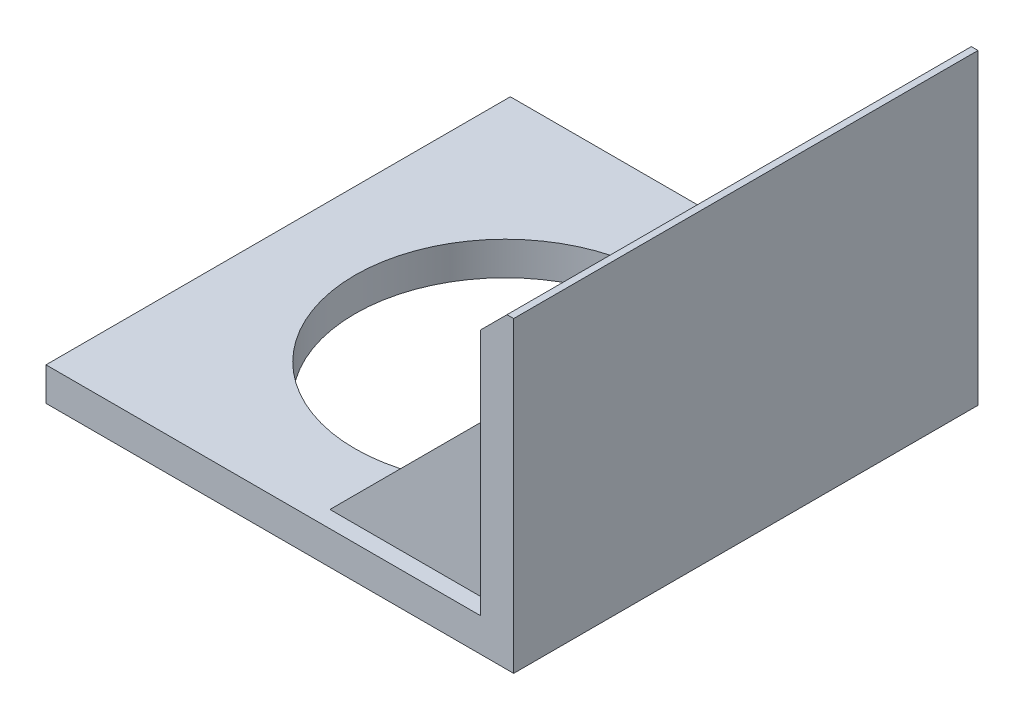
ISO-10303-21;
HEADER;
FILE_DESCRIPTION(('STEP AP214'),'2;1');
FILE_NAME('part.step','',(''),(''),'','','');
FILE_SCHEMA(('AUTOMOTIVE_DESIGN { 1 0 10303 214 1 1 1 1 }'));
ENDSEC;
DATA;
#1=APPLICATION_CONTEXT('core data for automotive mechanical design processes');
#2=APPLICATION_PROTOCOL_DEFINITION('international standard','automotive_design',2000,#1);
#3=PRODUCT_CONTEXT('',#1,'mechanical');
#4=PRODUCT('Part','Part','',(#3));
#5=PRODUCT_RELATED_PRODUCT_CATEGORY('part','',(#4));
#6=PRODUCT_DEFINITION_FORMATION('','',#4);
#7=PRODUCT_DEFINITION_CONTEXT('part definition',#1,'design');
#8=PRODUCT_DEFINITION('design','',#6,#7);
#9=PRODUCT_DEFINITION_SHAPE('','',#8);
#10=(LENGTH_UNIT() NAMED_UNIT(*) SI_UNIT(.MILLI.,.METRE.));
#11=(NAMED_UNIT(*) PLANE_ANGLE_UNIT() SI_UNIT($,.RADIAN.));
#12=(NAMED_UNIT(*) SI_UNIT($,.STERADIAN.) SOLID_ANGLE_UNIT());
#13=UNCERTAINTY_MEASURE_WITH_UNIT(LENGTH_MEASURE(1.E-05),#10,'distance_accuracy_value','');
#14=(GEOMETRIC_REPRESENTATION_CONTEXT(3) GLOBAL_UNCERTAINTY_ASSIGNED_CONTEXT((#13)) GLOBAL_UNIT_ASSIGNED_CONTEXT((#10,
#11,#12)) REPRESENTATION_CONTEXT('',''));
#15=CARTESIAN_POINT('',(0.,0.,0.));
#16=DIRECTION('',(0.,0.,1.));
#17=DIRECTION('',(1.,0.,0.));
#18=AXIS2_PLACEMENT_3D('',#15,#16,#17);
#19=CARTESIAN_POINT('',(0.,10.,0.));
#20=DIRECTION('',(0.,-1.,0.));
#21=DIRECTION('',(0.,0.,-1.));
#22=AXIS2_PLACEMENT_3D('',#19,#20,#21);
#23=PLANE('',#22);
#24=CARTESIAN_POINT('',(0.,10.,0.));
#25=DIRECTION('',(0.,1.,0.));
#26=DIRECTION('',(0.,0.,1.));
#27=AXIS2_PLACEMENT_3D('',#24,#25,#26);
#28=CIRCLE('',#27,45.);
#29=CARTESIAN_POINT('',(0.,10.,45.));
#30=VERTEX_POINT('',#29);
#31=EDGE_CURVE('E200',#30,#30,#28,.T.);
#32=ORIENTED_EDGE('',*,*,#31,.F.);
#33=EDGE_LOOP('',(#32));
#34=FACE_BOUND('',#33,.T.);
#35=DIRECTION('',(1.,0.,0.));
#36=VECTOR('',#35,1.);
#37=CARTESIAN_POINT('',(12.0000000000035,10.,-64.4999999999999));
#38=LINE('',#37,#36);
#39=CARTESIAN_POINT('',(12.0000000000035,10.,-64.4999999999999));
#40=VERTEX_POINT('',#39);
#41=CARTESIAN_POINT('',(62.0000000000035,10.,-64.4999999999999));
#42=VERTEX_POINT('',#41);
#43=EDGE_CURVE('E139',#40,#42,#38,.T.);
#44=ORIENTED_EDGE('',*,*,#43,.T.);
#45=DIRECTION('',(0.,0.,1.));
#46=VECTOR('',#45,1.);
#47=CARTESIAN_POINT('',(62.0000000000035,10.,-69.5000000000001));
#48=LINE('',#47,#46);
#49=CARTESIAN_POINT('',(62.0000000000035,10.,-69.5000000000001));
#50=VERTEX_POINT('',#49);
#51=EDGE_CURVE('E187',#50,#42,#48,.T.);
#52=ORIENTED_EDGE('',*,*,#51,.F.);
#53=DIRECTION('',(-1.,0.,0.));
#54=VECTOR('',#53,1.);
#55=CARTESIAN_POINT('',(3.49148133884313E-12,10.,-69.5000000000001));
#56=LINE('',#55,#54);
#57=CARTESIAN_POINT('',(-67.9999999999965,10.,-69.5));
#58=VERTEX_POINT('',#57);
#59=EDGE_CURVE('E206',#50,#58,#56,.T.);
#60=ORIENTED_EDGE('',*,*,#59,.T.);
#61=DIRECTION('',(0.,0.,1.));
#62=VECTOR('',#61,1.);
#63=CARTESIAN_POINT('',(-67.9999999999965,10.,-69.5));
#64=LINE('',#63,#62);
#65=CARTESIAN_POINT('',(-67.9999999999965,10.,69.5));
#66=VERTEX_POINT('',#65);
#67=EDGE_CURVE('E208',#58,#66,#64,.T.);
#68=ORIENTED_EDGE('',*,*,#67,.T.);
#69=DIRECTION('',(1.,0.,0.));
#70=VECTOR('',#69,1.);
#71=CARTESIAN_POINT('',(3.49148133884313E-12,10.,69.5000000000001));
#72=LINE('',#71,#70);
#73=CARTESIAN_POINT('',(62.0000000000035,10.,69.5000000000001));
#74=VERTEX_POINT('',#73);
#75=EDGE_CURVE('E211',#66,#74,#72,.T.);
#76=ORIENTED_EDGE('',*,*,#75,.T.);
#77=CARTESIAN_POINT('',(62.0000000000035,10.,64.5000000000001));
#78=VERTEX_POINT('',#77);
#79=EDGE_CURVE('E181',#78,#74,#48,.T.);
#80=ORIENTED_EDGE('',*,*,#79,.F.);
#81=DIRECTION('',(1.,0.,0.));
#82=VECTOR('',#81,1.);
#83=CARTESIAN_POINT('',(12.0000000000035,10.,64.5000000000001));
#84=LINE('',#83,#82);
#85=CARTESIAN_POINT('',(12.0000000000035,10.,64.5000000000001));
#86=VERTEX_POINT('',#85);
#87=EDGE_CURVE('E64',#86,#78,#84,.T.);
#88=ORIENTED_EDGE('',*,*,#87,.F.);
#89=DIRECTION('',(0.,0.,1.));
#90=VECTOR('',#89,1.);
#91=CARTESIAN_POINT('',(12.0000000000035,10.,56.5000000000001));
#92=LINE('',#91,#90);
#93=CARTESIAN_POINT('',(12.0000000000035,10.,56.5000000000001));
#94=VERTEX_POINT('',#93);
#95=EDGE_CURVE('E174',#94,#86,#92,.T.);
#96=ORIENTED_EDGE('',*,*,#95,.F.);
#97=DIRECTION('',(1.,0.,0.));
#98=VECTOR('',#97,1.);
#99=CARTESIAN_POINT('',(12.0000000000035,10.,56.5000000000001));
#100=LINE('',#99,#98);
#101=CARTESIAN_POINT('',(62.0000000000035,10.,56.5000000000001));
#102=VERTEX_POINT('',#101);
#103=EDGE_CURVE('E167',#94,#102,#100,.T.);
#104=ORIENTED_EDGE('',*,*,#103,.T.);
#105=CARTESIAN_POINT('',(62.0000000000035,10.,-56.4999999999999));
#106=VERTEX_POINT('',#105);
#107=EDGE_CURVE('E194',#106,#102,#48,.T.);
#108=ORIENTED_EDGE('',*,*,#107,.F.);
#109=DIRECTION('',(1.,0.,0.));
#110=VECTOR('',#109,1.);
#111=CARTESIAN_POINT('',(12.0000000000035,10.,-56.4999999999999));
#112=LINE('',#111,#110);
#113=CARTESIAN_POINT('',(12.0000000000035,10.,-56.4999999999999));
#114=VERTEX_POINT('',#113);
#115=EDGE_CURVE('E56',#114,#106,#112,.T.);
#116=ORIENTED_EDGE('',*,*,#115,.F.);
#117=DIRECTION('',(0.,0.,1.));
#118=VECTOR('',#117,1.);
#119=CARTESIAN_POINT('',(12.0000000000035,10.,-64.4999999999999));
#120=LINE('',#119,#118);
#121=EDGE_CURVE('E152',#40,#114,#120,.T.);
#122=ORIENTED_EDGE('',*,*,#121,.F.);
#123=EDGE_LOOP('',(#44,#52,#60,#68,#76,#80,#88,#96,#104,#108,#116,#122));
#124=FACE_BOUND('',#123,.T.);
#125=ADVANCED_FACE('F41',(#34,#124),#23,.F.);
#126=CARTESIAN_POINT('',(62.0000000000035,92.,-69.5000000000001));
#127=DIRECTION('',(1.,0.,0.));
#128=DIRECTION('',(0.,0.,-1.));
#129=AXIS2_PLACEMENT_3D('',#126,#127,#128);
#130=PLANE('',#129);
#131=DIRECTION('',(0.,1.,0.));
#132=VECTOR('',#131,1.);
#133=CARTESIAN_POINT('',(62.0000000000035,10.,-64.4999999999999));
#134=LINE('',#133,#132);
#135=CARTESIAN_POINT('',(62.0000000000035,60.,-64.4999999999999));
#136=VERTEX_POINT('',#135);
#137=EDGE_CURVE('E144',#42,#136,#134,.T.);
#138=ORIENTED_EDGE('',*,*,#137,.T.);
#139=DIRECTION('',(0.,0.,1.));
#140=VECTOR('',#139,1.);
#141=CARTESIAN_POINT('',(62.0000000000035,60.,-64.4999999999999));
#142=LINE('',#141,#140);
#143=CARTESIAN_POINT('',(62.0000000000035,60.,-56.4999999999999));
#144=VERTEX_POINT('',#143);
#145=EDGE_CURVE('E154',#136,#144,#142,.T.);
#146=ORIENTED_EDGE('',*,*,#145,.T.);
#147=DIRECTION('',(0.,1.,0.));
#148=VECTOR('',#147,1.);
#149=CARTESIAN_POINT('',(62.0000000000035,10.,-56.4999999999999));
#150=LINE('',#149,#148);
#151=EDGE_CURVE('E155',#106,#144,#150,.T.);
#152=ORIENTED_EDGE('',*,*,#151,.F.);
#153=ORIENTED_EDGE('',*,*,#107,.T.);
#154=DIRECTION('',(0.,1.,0.));
#155=VECTOR('',#154,1.);
#156=CARTESIAN_POINT('',(62.0000000000035,10.,56.5000000000001));
#157=LINE('',#156,#155);
#158=CARTESIAN_POINT('',(62.0000000000035,60.,56.5000000000001));
#159=VERTEX_POINT('',#158);
#160=EDGE_CURVE('E171',#102,#159,#157,.T.);
#161=ORIENTED_EDGE('',*,*,#160,.T.);
#162=DIRECTION('',(0.,0.,1.));
#163=VECTOR('',#162,1.);
#164=CARTESIAN_POINT('',(62.0000000000035,60.,56.5000000000001));
#165=LINE('',#164,#163);
#166=CARTESIAN_POINT('',(62.0000000000035,60.,64.5000000000001));
#167=VERTEX_POINT('',#166);
#168=EDGE_CURVE('E178',#159,#167,#165,.T.);
#169=ORIENTED_EDGE('',*,*,#168,.T.);
#170=DIRECTION('',(0.,1.,0.));
#171=VECTOR('',#170,1.);
#172=CARTESIAN_POINT('',(62.0000000000035,10.,64.5000000000001));
#173=LINE('',#172,#171);
#174=EDGE_CURVE('E168',#78,#167,#173,.T.);
#175=ORIENTED_EDGE('',*,*,#174,.F.);
#176=ORIENTED_EDGE('',*,*,#79,.T.);
#177=DIRECTION('',(0.,-1.,0.));
#178=VECTOR('',#177,1.);
#179=CARTESIAN_POINT('',(62.0000000000035,92.,69.5000000000001));
#180=LINE('',#179,#178);
#181=CARTESIAN_POINT('',(62.0000000000035,84.,69.5000000000001));
#182=VERTEX_POINT('',#181);
#183=EDGE_CURVE('E192',#182,#74,#180,.T.);
#184=ORIENTED_EDGE('',*,*,#183,.F.);
#185=DIRECTION('',(0.,0.,-1.));
#186=VECTOR('',#185,1.);
#187=CARTESIAN_POINT('',(62.0000000000035,84.,-69.5000000000001));
#188=LINE('',#187,#186);
#189=CARTESIAN_POINT('',(62.0000000000035,84.,-69.5000000000001));
#190=VERTEX_POINT('',#189);
#191=EDGE_CURVE('E49',#182,#190,#188,.T.);
#192=ORIENTED_EDGE('',*,*,#191,.T.);
#193=DIRECTION('',(0.,-1.,0.));
#194=VECTOR('',#193,1.);
#195=CARTESIAN_POINT('',(62.0000000000035,92.,-69.5000000000001));
#196=LINE('',#195,#194);
#197=EDGE_CURVE('E197',#190,#50,#196,.T.);
#198=ORIENTED_EDGE('',*,*,#197,.T.);
#199=ORIENTED_EDGE('',*,*,#51,.T.);
#200=EDGE_LOOP('',(#138,#146,#152,#153,#161,#169,#175,#176,#184,#192,#198,#199));
#201=FACE_BOUND('',#200,.T.);
#202=ADVANCED_FACE('F242',(#201),#130,.F.);
#203=CARTESIAN_POINT('',(0.,0.,0.));
#204=DIRECTION('',(0.,-1.,0.));
#205=DIRECTION('',(0.,0.,-1.));
#206=AXIS2_PLACEMENT_3D('',#203,#204,#205);
#207=PLANE('',#206);
#208=DIRECTION('',(-1.,0.,0.));
#209=VECTOR('',#208,1.);
#210=CARTESIAN_POINT('',(3.49148133884313E-12,0.,-69.5000000000001));
#211=LINE('',#210,#209);
#212=CARTESIAN_POINT('',(72.0000000000035,0.,-69.5000000000001));
#213=VERTEX_POINT('',#212);
#214=CARTESIAN_POINT('',(-67.9999999999965,0.,-69.5));
#215=VERTEX_POINT('',#214);
#216=EDGE_CURVE('E203',#213,#215,#211,.T.);
#217=ORIENTED_EDGE('',*,*,#216,.F.);
#218=DIRECTION('',(0.,0.,-1.));
#219=VECTOR('',#218,1.);
#220=CARTESIAN_POINT('',(72.0000000000035,0.,-69.5000000000001));
#221=LINE('',#220,#219);
#222=CARTESIAN_POINT('',(72.0000000000035,0.,69.5000000000001));
#223=VERTEX_POINT('',#222);
#224=EDGE_CURVE('E209',#223,#213,#221,.T.);
#225=ORIENTED_EDGE('',*,*,#224,.F.);
#226=DIRECTION('',(1.,0.,0.));
#227=VECTOR('',#226,1.);
#228=CARTESIAN_POINT('',(3.49148133884313E-12,0.,69.5000000000001));
#229=LINE('',#228,#227);
#230=CARTESIAN_POINT('',(-67.9999999999965,0.,69.5));
#231=VERTEX_POINT('',#230);
#232=EDGE_CURVE('E219',#231,#223,#229,.T.);
#233=ORIENTED_EDGE('',*,*,#232,.F.);
#234=DIRECTION('',(0.,0.,1.));
#235=VECTOR('',#234,1.);
#236=CARTESIAN_POINT('',(-67.9999999999965,0.,-69.5));
#237=LINE('',#236,#235);
#238=EDGE_CURVE('E216',#215,#231,#237,.T.);
#239=ORIENTED_EDGE('',*,*,#238,.F.);
#240=EDGE_LOOP('',(#217,#225,#233,#239));
#241=FACE_BOUND('',#240,.T.);
#242=CARTESIAN_POINT('',(0.,0.,0.));
#243=DIRECTION('',(0.,1.,0.));
#244=DIRECTION('',(0.,0.,1.));
#245=AXIS2_PLACEMENT_3D('',#242,#243,#244);
#246=CIRCLE('',#245,45.);
#247=CARTESIAN_POINT('',(0.,0.,45.));
#248=VERTEX_POINT('',#247);
#249=EDGE_CURVE('E199',#248,#248,#246,.T.);
#250=ORIENTED_EDGE('',*,*,#249,.T.);
#251=EDGE_LOOP('',(#250));
#252=FACE_BOUND('',#251,.T.);
#253=ADVANCED_FACE('F267',(#241,#252),#207,.T.);
#254=CARTESIAN_POINT('',(3.49148133884313E-12,10.,-69.5000000000001));
#255=DIRECTION('',(0.,0.,1.));
#256=DIRECTION('',(1.,0.,0.));
#257=AXIS2_PLACEMENT_3D('',#254,#255,#256);
#258=PLANE('',#257);
#259=ORIENTED_EDGE('',*,*,#197,.F.);
#260=DIRECTION('',(-0.707106781186547,-0.707106781186548,0.));
#261=VECTOR('',#260,1.);
#262=CARTESIAN_POINT('',(70.0000000000034,91.9999999999999,-69.5000000000002));
#263=LINE('',#262,#261);
#264=CARTESIAN_POINT('',(70.0000000000035,92.,-69.5000000000001));
#265=VERTEX_POINT('',#264);
#266=EDGE_CURVE('E11',#190,#265,#263,.F.);
#267=ORIENTED_EDGE('',*,*,#266,.T.);
#268=DIRECTION('',(-1.,0.,0.));
#269=VECTOR('',#268,1.);
#270=CARTESIAN_POINT('',(72.0000000000035,92.,-69.5000000000001));
#271=LINE('',#270,#269);
#272=CARTESIAN_POINT('',(72.0000000000035,92.,-69.5000000000001));
#273=VERTEX_POINT('',#272);
#274=EDGE_CURVE('E186',#273,#265,#271,.T.);
#275=ORIENTED_EDGE('',*,*,#274,.F.);
#276=DIRECTION('',(0.,-1.,0.));
#277=VECTOR('',#276,1.);
#278=CARTESIAN_POINT('',(72.0000000000035,10.,-69.5000000000001));
#279=LINE('',#278,#277);
#280=EDGE_CURVE('E214',#273,#213,#279,.T.);
#281=ORIENTED_EDGE('',*,*,#280,.T.);
#282=ORIENTED_EDGE('',*,*,#216,.T.);
#283=DIRECTION('',(0.,-1.,0.));
#284=VECTOR('',#283,1.);
#285=CARTESIAN_POINT('',(-67.9999999999965,10.,-69.5));
#286=LINE('',#285,#284);
#287=EDGE_CURVE('E231',#58,#215,#286,.T.);
#288=ORIENTED_EDGE('',*,*,#287,.F.);
#289=ORIENTED_EDGE('',*,*,#59,.F.);
#290=EDGE_LOOP('',(#259,#267,#275,#281,#282,#288,#289));
#291=FACE_BOUND('',#290,.T.);
#292=ADVANCED_FACE('F247',(#291),#258,.F.);
#293=CARTESIAN_POINT('',(-67.9999999999965,10.,-69.5));
#294=DIRECTION('',(1.,0.,0.));
#295=DIRECTION('',(0.,0.,-1.));
#296=AXIS2_PLACEMENT_3D('',#293,#294,#295);
#297=PLANE('',#296);
#298=ORIENTED_EDGE('',*,*,#238,.T.);
#299=DIRECTION('',(0.,-1.,0.));
#300=VECTOR('',#299,1.);
#301=CARTESIAN_POINT('',(-67.9999999999965,10.,69.5));
#302=LINE('',#301,#300);
#303=EDGE_CURVE('E228',#66,#231,#302,.T.);
#304=ORIENTED_EDGE('',*,*,#303,.F.);
#305=ORIENTED_EDGE('',*,*,#67,.F.);
#306=ORIENTED_EDGE('',*,*,#287,.T.);
#307=EDGE_LOOP('',(#298,#304,#305,#306));
#308=FACE_BOUND('',#307,.T.);
#309=ADVANCED_FACE('F265',(#308),#297,.F.);
#310=CARTESIAN_POINT('',(3.49148133884313E-12,10.,69.5000000000001));
#311=DIRECTION('',(0.,0.,-1.));
#312=DIRECTION('',(-1.,0.,0.));
#313=AXIS2_PLACEMENT_3D('',#310,#311,#312);
#314=PLANE('',#313);
#315=DIRECTION('',(1.,0.,0.));
#316=VECTOR('',#315,1.);
#317=CARTESIAN_POINT('',(72.0000000000035,92.,69.5000000000001));
#318=LINE('',#317,#316);
#319=CARTESIAN_POINT('',(70.0000000000035,92.,69.5000000000001));
#320=VERTEX_POINT('',#319);
#321=CARTESIAN_POINT('',(72.0000000000035,92.,69.5000000000001));
#322=VERTEX_POINT('',#321);
#323=EDGE_CURVE('E190',#320,#322,#318,.T.);
#324=ORIENTED_EDGE('',*,*,#323,.F.);
#325=DIRECTION('',(0.707106781186547,0.707106781186548,0.));
#326=VECTOR('',#325,1.);
#327=CARTESIAN_POINT('',(70.0000000000035,92.,69.5000000000001));
#328=LINE('',#327,#326);
#329=EDGE_CURVE('E237',#320,#182,#328,.F.);
#330=ORIENTED_EDGE('',*,*,#329,.T.);
#331=ORIENTED_EDGE('',*,*,#183,.T.);
#332=ORIENTED_EDGE('',*,*,#75,.F.);
#333=ORIENTED_EDGE('',*,*,#303,.T.);
#334=ORIENTED_EDGE('',*,*,#232,.T.);
#335=DIRECTION('',(0.,-1.,0.));
#336=VECTOR('',#335,1.);
#337=CARTESIAN_POINT('',(72.0000000000035,10.,69.5000000000001));
#338=LINE('',#337,#336);
#339=EDGE_CURVE('E225',#322,#223,#338,.T.);
#340=ORIENTED_EDGE('',*,*,#339,.F.);
#341=EDGE_LOOP('',(#324,#330,#331,#332,#333,#334,#340));
#342=FACE_BOUND('',#341,.T.);
#343=ADVANCED_FACE('F256',(#342),#314,.F.);
#344=CARTESIAN_POINT('',(72.0000000000035,10.,-69.5000000000001));
#345=DIRECTION('',(-1.,0.,0.));
#346=DIRECTION('',(0.,0.,1.));
#347=AXIS2_PLACEMENT_3D('',#344,#345,#346);
#348=PLANE('',#347);
#349=ORIENTED_EDGE('',*,*,#224,.T.);
#350=ORIENTED_EDGE('',*,*,#280,.F.);
#351=DIRECTION('',(0.,0.,-1.));
#352=VECTOR('',#351,1.);
#353=CARTESIAN_POINT('',(72.0000000000035,92.,-69.5000000000001));
#354=LINE('',#353,#352);
#355=EDGE_CURVE('E183',#322,#273,#354,.T.);
#356=ORIENTED_EDGE('',*,*,#355,.F.);
#357=ORIENTED_EDGE('',*,*,#339,.T.);
#358=EDGE_LOOP('',(#349,#350,#356,#357));
#359=FACE_BOUND('',#358,.T.);
#360=ADVANCED_FACE('F260',(#359),#348,.F.);
#361=CARTESIAN_POINT('',(0.,10.,0.));
#362=DIRECTION('',(0.,-1.,0.));
#363=DIRECTION('',(0.,0.,-1.));
#364=AXIS2_PLACEMENT_3D('',#361,#362,#363);
#365=CYLINDRICAL_SURFACE('',#364,45.);
#366=ORIENTED_EDGE('',*,*,#31,.T.);
#367=EDGE_LOOP('',(#366));
#368=FACE_BOUND('',#367,.T.);
#369=ORIENTED_EDGE('',*,*,#249,.F.);
#370=EDGE_LOOP('',(#369));
#371=FACE_BOUND('',#370,.T.);
#372=ADVANCED_FACE('F273',(#368,#371),#365,.F.);
#373=CARTESIAN_POINT('',(0.,92.,0.));
#374=DIRECTION('',(0.,-1.,0.));
#375=DIRECTION('',(0.,0.,-1.));
#376=AXIS2_PLACEMENT_3D('',#373,#374,#375);
#377=PLANE('',#376);
#378=ORIENTED_EDGE('',*,*,#274,.T.);
#379=DIRECTION('',(0.,0.,1.));
#380=VECTOR('',#379,1.);
#381=CARTESIAN_POINT('',(70.0000000000035,92.,0.));
#382=LINE('',#381,#380);
#383=EDGE_CURVE('E234',#265,#320,#382,.T.);
#384=ORIENTED_EDGE('',*,*,#383,.T.);
#385=ORIENTED_EDGE('',*,*,#323,.T.);
#386=ORIENTED_EDGE('',*,*,#355,.T.);
#387=EDGE_LOOP('',(#378,#384,#385,#386));
#388=FACE_BOUND('',#387,.T.);
#389=ADVANCED_FACE('F253',(#388),#377,.F.);
#390=CARTESIAN_POINT('',(70.0000000000035,92.,0.));
#391=DIRECTION('',(0.707106781186548,-0.707106781186547,0.));
#392=DIRECTION('',(0.,0.,1.));
#393=AXIS2_PLACEMENT_3D('',#390,#391,#392);
#394=PLANE('',#393);
#395=ORIENTED_EDGE('',*,*,#266,.F.);
#396=ORIENTED_EDGE('',*,*,#191,.F.);
#397=ORIENTED_EDGE('',*,*,#329,.F.);
#398=ORIENTED_EDGE('',*,*,#383,.F.);
#399=EDGE_LOOP('',(#395,#396,#397,#398));
#400=FACE_BOUND('',#399,.T.);
#401=ADVANCED_FACE('F43',(#400),#394,.F.);
#402=CARTESIAN_POINT('',(62.0000000000035,60.,56.5000000000001));
#403=DIRECTION('',(-0.707106781186548,0.707106781186547,0.));
#404=DIRECTION('',(-0.707106781186547,-0.707106781186548,0.));
#405=AXIS2_PLACEMENT_3D('',#402,#403,#404);
#406=PLANE('',#405);
#407=DIRECTION('',(-0.707106781186547,-0.707106781186548,0.));
#408=VECTOR('',#407,1.);
#409=CARTESIAN_POINT('',(62.0000000000035,60.,64.5000000000001));
#410=LINE('',#409,#408);
#411=EDGE_CURVE('E159',#167,#86,#410,.T.);
#412=ORIENTED_EDGE('',*,*,#411,.F.);
#413=ORIENTED_EDGE('',*,*,#168,.F.);
#414=DIRECTION('',(-0.707106781186547,-0.707106781186548,0.));
#415=VECTOR('',#414,1.);
#416=CARTESIAN_POINT('',(62.0000000000035,60.,56.5000000000001));
#417=LINE('',#416,#415);
#418=EDGE_CURVE('E164',#159,#94,#417,.T.);
#419=ORIENTED_EDGE('',*,*,#418,.T.);
#420=ORIENTED_EDGE('',*,*,#95,.T.);
#421=EDGE_LOOP('',(#412,#413,#419,#420));
#422=FACE_BOUND('',#421,.T.);
#423=ADVANCED_FACE('F318',(#422),#406,.T.);
#424=CARTESIAN_POINT('',(0.,0.,56.5000000000001));
#425=DIRECTION('',(0.,0.,1.));
#426=DIRECTION('',(1.,0.,0.));
#427=AXIS2_PLACEMENT_3D('',#424,#425,#426);
#428=PLANE('',#427);
#429=ORIENTED_EDGE('',*,*,#418,.F.);
#430=ORIENTED_EDGE('',*,*,#160,.F.);
#431=ORIENTED_EDGE('',*,*,#103,.F.);
#432=EDGE_LOOP('',(#429,#430,#431));
#433=FACE_BOUND('',#432,.T.);
#434=ADVANCED_FACE('F325',(#433),#428,.F.);
#435=CARTESIAN_POINT('',(0.,0.,64.5000000000001));
#436=DIRECTION('',(0.,0.,1.));
#437=DIRECTION('',(1.,0.,0.));
#438=AXIS2_PLACEMENT_3D('',#435,#436,#437);
#439=PLANE('',#438);
#440=ORIENTED_EDGE('',*,*,#411,.T.);
#441=ORIENTED_EDGE('',*,*,#87,.T.);
#442=ORIENTED_EDGE('',*,*,#174,.T.);
#443=EDGE_LOOP('',(#440,#441,#442));
#444=FACE_BOUND('',#443,.T.);
#445=ADVANCED_FACE('F333',(#444),#439,.T.);
#446=CARTESIAN_POINT('',(62.0000000000035,60.,-64.4999999999999));
#447=DIRECTION('',(-0.707106781186548,0.707106781186547,0.));
#448=DIRECTION('',(-0.707106781186547,-0.707106781186548,0.));
#449=AXIS2_PLACEMENT_3D('',#446,#447,#448);
#450=PLANE('',#449);
#451=DIRECTION('',(-0.707106781186547,-0.707106781186548,0.));
#452=VECTOR('',#451,1.);
#453=CARTESIAN_POINT('',(62.0000000000035,60.,-56.4999999999999));
#454=LINE('',#453,#452);
#455=EDGE_CURVE('E381',#144,#114,#454,.T.);
#456=ORIENTED_EDGE('',*,*,#455,.F.);
#457=ORIENTED_EDGE('',*,*,#145,.F.);
#458=DIRECTION('',(-0.707106781186547,-0.707106781186548,0.));
#459=VECTOR('',#458,1.);
#460=CARTESIAN_POINT('',(62.0000000000035,60.,-64.4999999999999));
#461=LINE('',#460,#459);
#462=EDGE_CURVE('E142',#136,#40,#461,.T.);
#463=ORIENTED_EDGE('',*,*,#462,.T.);
#464=ORIENTED_EDGE('',*,*,#121,.T.);
#465=EDGE_LOOP('',(#456,#457,#463,#464));
#466=FACE_BOUND('',#465,.T.);
#467=ADVANCED_FACE('F151',(#466),#450,.T.);
#468=CARTESIAN_POINT('',(0.,0.,-64.4999999999999));
#469=DIRECTION('',(0.,0.,1.));
#470=DIRECTION('',(1.,0.,0.));
#471=AXIS2_PLACEMENT_3D('',#468,#469,#470);
#472=PLANE('',#471);
#473=ORIENTED_EDGE('',*,*,#462,.F.);
#474=ORIENTED_EDGE('',*,*,#137,.F.);
#475=ORIENTED_EDGE('',*,*,#43,.F.);
#476=EDGE_LOOP('',(#473,#474,#475));
#477=FACE_BOUND('',#476,.T.);
#478=ADVANCED_FACE('F141',(#477),#472,.F.);
#479=CARTESIAN_POINT('',(0.,0.,-56.4999999999999));
#480=DIRECTION('',(0.,0.,1.));
#481=DIRECTION('',(1.,0.,0.));
#482=AXIS2_PLACEMENT_3D('',#479,#480,#481);
#483=PLANE('',#482);
#484=ORIENTED_EDGE('',*,*,#455,.T.);
#485=ORIENTED_EDGE('',*,*,#115,.T.);
#486=ORIENTED_EDGE('',*,*,#151,.T.);
#487=EDGE_LOOP('',(#484,#485,#486));
#488=FACE_BOUND('',#487,.T.);
#489=ADVANCED_FACE('F370',(#488),#483,.T.);
#490=CLOSED_SHELL('',(#125,#202,#253,#292,#309,#343,#360,#372,#389,#401,#423,#434,#445,#467,
#478,#489));
#491=MANIFOLD_SOLID_BREP('B2',#490);
#492=ADVANCED_BREP_SHAPE_REPRESENTATION('',(#18,#491),#14);
#493=SHAPE_DEFINITION_REPRESENTATION(#9,#492);
ENDSEC;
END-ISO-10303-21;
